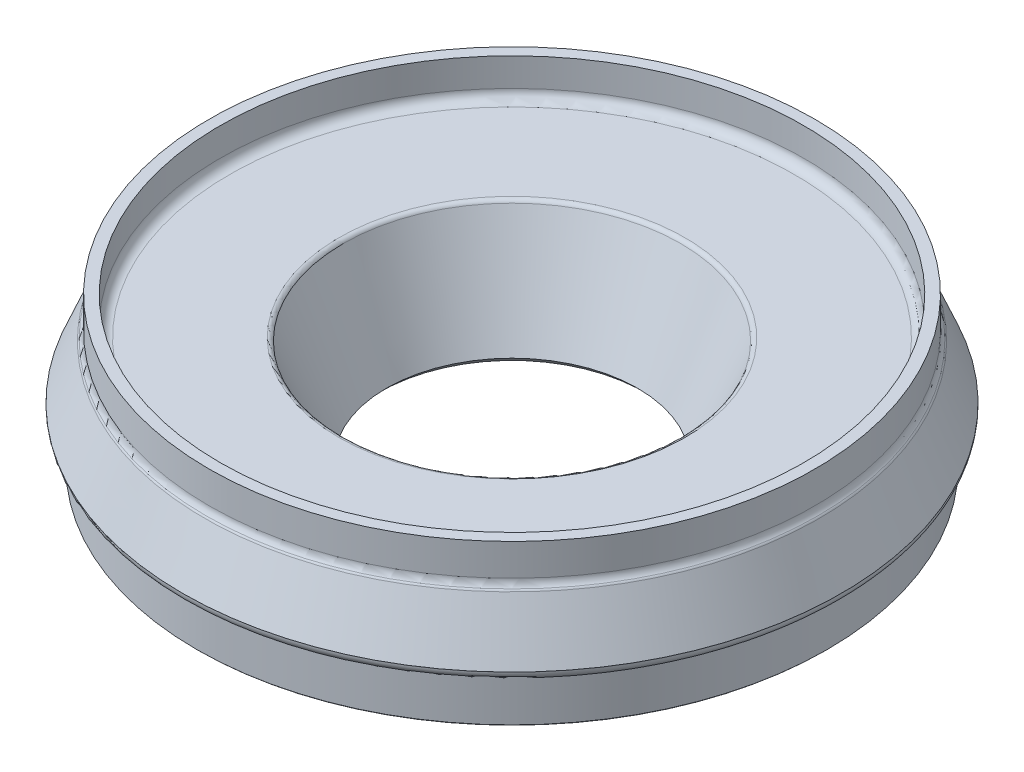
ISO-10303-21;
HEADER;
FILE_DESCRIPTION(('STEP AP214'),'2;1');
FILE_NAME('part.step','',(''),(''),'','','');
FILE_SCHEMA(('AUTOMOTIVE_DESIGN { 1 0 10303 214 1 1 1 1 }'));
ENDSEC;
DATA;
#1=APPLICATION_CONTEXT('core data for automotive mechanical design processes');
#2=APPLICATION_PROTOCOL_DEFINITION('international standard','automotive_design',2000,#1);
#3=PRODUCT_CONTEXT('',#1,'mechanical');
#4=PRODUCT('Part','Part','',(#3));
#5=PRODUCT_RELATED_PRODUCT_CATEGORY('part','',(#4));
#6=PRODUCT_DEFINITION_FORMATION('','',#4);
#7=PRODUCT_DEFINITION_CONTEXT('part definition',#1,'design');
#8=PRODUCT_DEFINITION('design','',#6,#7);
#9=PRODUCT_DEFINITION_SHAPE('','',#8);
#10=(LENGTH_UNIT() NAMED_UNIT(*) SI_UNIT(.MILLI.,.METRE.));
#11=(NAMED_UNIT(*) PLANE_ANGLE_UNIT() SI_UNIT($,.RADIAN.));
#12=(NAMED_UNIT(*) SI_UNIT($,.STERADIAN.) SOLID_ANGLE_UNIT());
#13=UNCERTAINTY_MEASURE_WITH_UNIT(LENGTH_MEASURE(1.E-05),#10,'distance_accuracy_value','');
#14=(GEOMETRIC_REPRESENTATION_CONTEXT(3) GLOBAL_UNCERTAINTY_ASSIGNED_CONTEXT((#13)) GLOBAL_UNIT_ASSIGNED_CONTEXT((#10,
#11,#12)) REPRESENTATION_CONTEXT('',''));
#15=CARTESIAN_POINT('',(0.,0.,0.));
#16=DIRECTION('',(0.,0.,1.));
#17=DIRECTION('',(1.,0.,0.));
#18=AXIS2_PLACEMENT_3D('',#15,#16,#17);
#19=CARTESIAN_POINT('',(0.,0.,0.));
#20=DIRECTION('',(0.,1.,0.));
#21=DIRECTION('',(0.,0.,1.));
#22=AXIS2_PLACEMENT_3D('',#19,#20,#21);
#23=PLANE('',#22);
#24=CARTESIAN_POINT('',(-1.805,0.,0.));
#25=DIRECTION('',(0.,1.,0.));
#26=DIRECTION('',(0.,0.,1.));
#27=AXIS2_PLACEMENT_3D('',#24,#25,#26);
#28=CIRCLE('',#27,3.34);
#29=CARTESIAN_POINT('',(-1.805,0.,3.34));
#30=VERTEX_POINT('',#29);
#31=EDGE_CURVE('E45',#30,#30,#28,.F.);
#32=ORIENTED_EDGE('',*,*,#31,.T.);
#33=EDGE_LOOP('',(#32));
#34=FACE_BOUND('',#33,.T.);
#35=CARTESIAN_POINT('',(-1.805,0.,0.));
#36=DIRECTION('',(0.,1.,0.));
#37=DIRECTION('',(0.,0.,1.));
#38=AXIS2_PLACEMENT_3D('',#35,#36,#37);
#39=CIRCLE('',#38,1.405);
#40=CARTESIAN_POINT('',(-1.805,0.,1.405));
#41=VERTEX_POINT('',#40);
#42=EDGE_CURVE('E60',#41,#41,#39,.T.);
#43=ORIENTED_EDGE('',*,*,#42,.T.);
#44=EDGE_LOOP('',(#43));
#45=FACE_BOUND('',#44,.T.);
#46=ADVANCED_FACE('F34',(#34,#45),#23,.F.);
#47=CARTESIAN_POINT('',(0.,1.20334128550827,0.));
#48=DIRECTION('',(0.,1.,0.));
#49=DIRECTION('',(0.,0.,1.));
#50=AXIS2_PLACEMENT_3D('',#47,#48,#49);
#51=PLANE('',#50);
#52=CARTESIAN_POINT('',(-1.805,1.20334128550827,0.));
#53=DIRECTION('',(0.,1.,0.));
#54=DIRECTION('',(0.,0.,1.));
#55=AXIS2_PLACEMENT_3D('',#52,#53,#54);
#56=CIRCLE('',#55,3.);
#57=CARTESIAN_POINT('',(-1.805,1.20334128550827,3.));
#58=VERTEX_POINT('',#57);
#59=EDGE_CURVE('E72',#58,#58,#56,.T.);
#60=ORIENTED_EDGE('',*,*,#59,.T.);
#61=EDGE_LOOP('',(#60));
#62=FACE_BOUND('',#61,.T.);
#63=CARTESIAN_POINT('',(-1.805,1.20334128550827,0.));
#64=DIRECTION('',(0.,1.,0.));
#65=DIRECTION('',(0.,0.,1.));
#66=AXIS2_PLACEMENT_3D('',#63,#64,#65);
#67=CIRCLE('',#66,1.8383689580383);
#68=CARTESIAN_POINT('',(-1.805,1.20334128550827,1.8383689580383));
#69=VERTEX_POINT('',#68);
#70=EDGE_CURVE('E81',#69,#69,#67,.F.);
#71=ORIENTED_EDGE('',*,*,#70,.T.);
#72=EDGE_LOOP('',(#71));
#73=FACE_BOUND('',#72,.T.);
#74=ADVANCED_FACE('F116',(#62,#73),#51,.T.);
#75=CARTESIAN_POINT('',(-1.805,1.20334128550827,0.));
#76=DIRECTION('',(0.,-1.,0.));
#77=DIRECTION('',(0.,0.,-1.));
#78=AXIS2_PLACEMENT_3D('',#75,#76,#77);
#79=CONICAL_SURFACE('',#78,3.25108159784945,0.392270948316505);
#80=CARTESIAN_POINT('',(-1.805,1.17245567819005,0.));
#81=DIRECTION('',(0.,-1.,0.));
#82=DIRECTION('',(0.,0.,-1.));
#83=AXIS2_PLACEMENT_3D('',#80,#81,#82);
#84=CIRCLE('',#83,3.26385934613364);
#85=CARTESIAN_POINT('',(-1.805,1.17245567819005,-3.26385934613364));
#86=VERTEX_POINT('',#85);
#87=EDGE_CURVE('E84',#86,#86,#84,.T.);
#88=ORIENTED_EDGE('',*,*,#87,.T.);
#89=EDGE_LOOP('',(#88));
#90=FACE_BOUND('',#89,.T.);
#91=CARTESIAN_POINT('',(-1.805,0.601670642754135,0.));
#92=DIRECTION('',(0.,-1.,0.));
#93=DIRECTION('',(0.,0.,-1.));
#94=AXIS2_PLACEMENT_3D('',#91,#92,#93);
#95=CIRCLE('',#94,3.5);
#96=CARTESIAN_POINT('',(-1.805,0.601670642754135,-3.5));
#97=VERTEX_POINT('',#96);
#98=EDGE_CURVE('E87',#97,#97,#95,.T.);
#99=ORIENTED_EDGE('',*,*,#98,.F.);
#100=EDGE_LOOP('',(#99));
#101=FACE_BOUND('',#100,.T.);
#102=ADVANCED_FACE('F122',(#90,#101),#79,.T.);
#103=CARTESIAN_POINT('',(-1.805,1.20334128550827,0.));
#104=DIRECTION('',(0.,1.,0.));
#105=DIRECTION('',(0.,0.,1.));
#106=AXIS2_PLACEMENT_3D('',#103,#104,#105);
#107=CONICAL_SURFACE('',#106,1.805,0.393804913795669);
#108=CARTESIAN_POINT('',(-1.805,0.0706459296058926,0.));
#109=DIRECTION('',(0.,1.,0.));
#110=DIRECTION('',(0.,0.,1.));
#111=AXIS2_PLACEMENT_3D('',#108,#109,#110);
#112=CIRCLE('',#111,1.33435407039411);
#113=CARTESIAN_POINT('',(-1.805,0.0706459296058926,1.33435407039411));
#114=VERTEX_POINT('',#113);
#115=EDGE_CURVE('E63',#114,#114,#112,.F.);
#116=ORIENTED_EDGE('',*,*,#115,.T.);
#117=EDGE_LOOP('',(#116));
#118=FACE_BOUND('',#117,.T.);
#119=CARTESIAN_POINT('',(-1.805,1.1725265281989,0.));
#120=DIRECTION('',(0.,-1.,0.));
#121=DIRECTION('',(0.,0.,-1.));
#122=AXIS2_PLACEMENT_3D('',#119,#120,#121);
#123=CIRCLE('',#122,1.79219616883403);
#124=CARTESIAN_POINT('',(-1.805,1.1725265281989,-1.79219616883403));
#125=VERTEX_POINT('',#124);
#126=EDGE_CURVE('E78',#125,#125,#123,.F.);
#127=ORIENTED_EDGE('',*,*,#126,.T.);
#128=EDGE_LOOP('',(#127));
#129=FACE_BOUND('',#128,.T.);
#130=ADVANCED_FACE('F129',(#118,#129),#107,.F.);
#131=CARTESIAN_POINT('',(-1.805,0.,0.));
#132=DIRECTION('',(0.,-1.,0.));
#133=DIRECTION('',(0.,0.,-1.));
#134=AXIS2_PLACEMENT_3D('',#131,#132,#133);
#135=CYLINDRICAL_SURFACE('',#134,3.5);
#136=CARTESIAN_POINT('',(-1.805,0.6,0.));
#137=DIRECTION('',(0.,1.,0.));
#138=DIRECTION('',(0.,0.,1.));
#139=AXIS2_PLACEMENT_3D('',#136,#137,#138);
#140=CIRCLE('',#139,3.5);
#141=CARTESIAN_POINT('',(-1.805,0.6,3.5));
#142=VERTEX_POINT('',#141);
#143=EDGE_CURVE('E41',#142,#142,#140,.T.);
#144=ORIENTED_EDGE('',*,*,#143,.T.);
#145=EDGE_LOOP('',(#144));
#146=FACE_BOUND('',#145,.T.);
#147=ORIENTED_EDGE('',*,*,#98,.T.);
#148=EDGE_LOOP('',(#147));
#149=FACE_BOUND('',#148,.T.);
#150=ADVANCED_FACE('F128',(#146,#149),#135,.T.);
#151=CARTESIAN_POINT('',(-1.805,1.15334128550827,0.));
#152=DIRECTION('',(0.,1.,0.));
#153=DIRECTION('',(0.,0.,1.));
#154=AXIS2_PLACEMENT_3D('',#151,#152,#153);
#155=TOROIDAL_SURFACE('',#154,3.21765718176435,0.05);
#156=CARTESIAN_POINT('',(-1.805,1.1906090851333,0.));
#157=DIRECTION('',(0.,-1.,0.));
#158=DIRECTION('',(0.,0.,-1.));
#159=AXIS2_PLACEMENT_3D('',#156,#157,#158);
#160=CIRCLE('',#159,3.25099051509771);
#161=CARTESIAN_POINT('',(-1.805,1.1906090851333,-3.25099051509771));
#162=VERTEX_POINT('',#161);
#163=EDGE_CURVE('E66',#162,#162,#160,.T.);
#164=ORIENTED_EDGE('',*,*,#163,.T.);
#165=EDGE_LOOP('',(#164));
#166=FACE_BOUND('',#165,.T.);
#167=ORIENTED_EDGE('',*,*,#87,.F.);
#168=EDGE_LOOP('',(#167));
#169=FACE_BOUND('',#168,.T.);
#170=ADVANCED_FACE('F111',(#166,#169),#155,.T.);
#171=CARTESIAN_POINT('',(-1.805,1.15334128550827,0.));
#172=DIRECTION('',(0.,1.,0.));
#173=DIRECTION('',(0.,0.,1.));
#174=AXIS2_PLACEMENT_3D('',#171,#172,#173);
#175=TOROIDAL_SURFACE('',#174,1.8383689580383,0.05);
#176=ORIENTED_EDGE('',*,*,#126,.F.);
#177=EDGE_LOOP('',(#176));
#178=FACE_BOUND('',#177,.T.);
#179=ORIENTED_EDGE('',*,*,#70,.F.);
#180=EDGE_LOOP('',(#179));
#181=FACE_BOUND('',#180,.T.);
#182=ADVANCED_FACE('F102',(#178,#181),#175,.T.);
#183=CARTESIAN_POINT('',(-1.805,1.60334128550827,0.));
#184=DIRECTION('',(0.,1.,0.));
#185=DIRECTION('',(0.,0.,1.));
#186=AXIS2_PLACEMENT_3D('',#183,#184,#185);
#187=PLANE('',#186);
#188=CARTESIAN_POINT('',(-1.805,1.60334128550827,0.));
#189=DIRECTION('',(0.,1.,0.));
#190=DIRECTION('',(0.,0.,1.));
#191=AXIS2_PLACEMENT_3D('',#188,#189,#190);
#192=CIRCLE('',#191,3.21765718176435);
#193=CARTESIAN_POINT('',(-1.805,1.60334128550827,3.21765718176435));
#194=VERTEX_POINT('',#193);
#195=EDGE_CURVE('E90',#194,#194,#192,.T.);
#196=ORIENTED_EDGE('',*,*,#195,.T.);
#197=EDGE_LOOP('',(#196));
#198=FACE_BOUND('',#197,.T.);
#199=CARTESIAN_POINT('',(-1.805,1.60334128550827,0.));
#200=DIRECTION('',(0.,1.,0.));
#201=DIRECTION('',(0.,0.,1.));
#202=AXIS2_PLACEMENT_3D('',#199,#200,#201);
#203=CIRCLE('',#202,3.1);
#204=CARTESIAN_POINT('',(-1.805,1.60334128550827,3.1));
#205=VERTEX_POINT('',#204);
#206=EDGE_CURVE('E93',#205,#205,#203,.T.);
#207=ORIENTED_EDGE('',*,*,#206,.F.);
#208=EDGE_LOOP('',(#207));
#209=FACE_BOUND('',#208,.T.);
#210=ADVANCED_FACE('F99',(#198,#209),#187,.T.);
#211=CARTESIAN_POINT('',(-1.805,1.60334128550827,0.));
#212=DIRECTION('',(0.,-1.,0.));
#213=DIRECTION('',(0.,0.,-1.));
#214=AXIS2_PLACEMENT_3D('',#211,#212,#213);
#215=CYLINDRICAL_SURFACE('',#214,3.21765718176435);
#216=CARTESIAN_POINT('',(-1.805,1.26514468438326,0.));
#217=DIRECTION('',(0.,1.,0.));
#218=DIRECTION('',(0.,0.,1.));
#219=AXIS2_PLACEMENT_3D('',#216,#217,#218);
#220=CIRCLE('',#219,3.21765718176435);
#221=CARTESIAN_POINT('',(-1.805,1.26514468438326,3.21765718176435));
#222=VERTEX_POINT('',#221);
#223=EDGE_CURVE('E69',#222,#222,#220,.T.);
#224=ORIENTED_EDGE('',*,*,#223,.T.);
#225=EDGE_LOOP('',(#224));
#226=FACE_BOUND('',#225,.T.);
#227=ORIENTED_EDGE('',*,*,#195,.F.);
#228=EDGE_LOOP('',(#227));
#229=FACE_BOUND('',#228,.T.);
#230=ADVANCED_FACE('F101',(#226,#229),#215,.T.);
#231=CARTESIAN_POINT('',(-1.805,1.60334128550827,0.));
#232=DIRECTION('',(0.,-1.,0.));
#233=DIRECTION('',(0.,0.,-1.));
#234=AXIS2_PLACEMENT_3D('',#231,#232,#233);
#235=CYLINDRICAL_SURFACE('',#234,3.1);
#236=CARTESIAN_POINT('',(-1.805,1.30334128550827,0.));
#237=DIRECTION('',(0.,1.,0.));
#238=DIRECTION('',(0.,0.,1.));
#239=AXIS2_PLACEMENT_3D('',#236,#237,#238);
#240=CIRCLE('',#239,3.1);
#241=CARTESIAN_POINT('',(-1.805,1.30334128550827,3.1));
#242=VERTEX_POINT('',#241);
#243=EDGE_CURVE('E75',#242,#242,#240,.F.);
#244=ORIENTED_EDGE('',*,*,#243,.T.);
#245=EDGE_LOOP('',(#244));
#246=FACE_BOUND('',#245,.T.);
#247=ORIENTED_EDGE('',*,*,#206,.T.);
#248=EDGE_LOOP('',(#247));
#249=FACE_BOUND('',#248,.T.);
#250=ADVANCED_FACE('F97',(#246,#249),#235,.F.);
#251=CARTESIAN_POINT('',(-1.805,1.30334128550827,0.));
#252=DIRECTION('',(0.,1.,0.));
#253=DIRECTION('',(0.,0.,1.));
#254=AXIS2_PLACEMENT_3D('',#251,#252,#253);
#255=TOROIDAL_SURFACE('',#254,3.,0.1);
#256=ORIENTED_EDGE('',*,*,#59,.F.);
#257=EDGE_LOOP('',(#256));
#258=FACE_BOUND('',#257,.T.);
#259=ORIENTED_EDGE('',*,*,#243,.F.);
#260=EDGE_LOOP('',(#259));
#261=FACE_BOUND('',#260,.T.);
#262=ADVANCED_FACE('F139',(#258,#261),#255,.F.);
#263=CARTESIAN_POINT('',(-1.805,1.26514468438326,0.));
#264=DIRECTION('',(0.,1.,0.));
#265=DIRECTION('',(0.,0.,1.));
#266=AXIS2_PLACEMENT_3D('',#263,#264,#265);
#267=TOROIDAL_SURFACE('',#266,3.31765718176435,0.1);
#268=ORIENTED_EDGE('',*,*,#163,.F.);
#269=EDGE_LOOP('',(#268));
#270=FACE_BOUND('',#269,.T.);
#271=ORIENTED_EDGE('',*,*,#223,.F.);
#272=EDGE_LOOP('',(#271));
#273=FACE_BOUND('',#272,.T.);
#274=ADVANCED_FACE('F142',(#270,#273),#267,.F.);
#275=CARTESIAN_POINT('',(-1.805,0.0706459296058927,0.));
#276=DIRECTION('',(0.,-1.,0.));
#277=DIRECTION('',(0.,0.,-1.));
#278=AXIS2_PLACEMENT_3D('',#275,#276,#277);
#279=CONICAL_SURFACE('',#278,1.33435407039411,0.785398163397442);
#280=ORIENTED_EDGE('',*,*,#42,.F.);
#281=EDGE_LOOP('',(#280));
#282=FACE_BOUND('',#281,.T.);
#283=ORIENTED_EDGE('',*,*,#115,.F.);
#284=EDGE_LOOP('',(#283));
#285=FACE_BOUND('',#284,.T.);
#286=ADVANCED_FACE('F146',(#282,#285),#279,.F.);
#287=CARTESIAN_POINT('',(-1.805,0.5,0.));
#288=DIRECTION('',(0.,1.,0.));
#289=DIRECTION('',(0.,0.,1.));
#290=AXIS2_PLACEMENT_3D('',#287,#288,#289);
#291=PLANE('',#290);
#292=CARTESIAN_POINT('',(-1.805,0.5,0.));
#293=DIRECTION('',(0.,1.,0.));
#294=DIRECTION('',(0.,0.,1.));
#295=AXIS2_PLACEMENT_3D('',#292,#293,#294);
#296=CIRCLE('',#295,3.4);
#297=CARTESIAN_POINT('',(-1.805,0.5,3.4));
#298=VERTEX_POINT('',#297);
#299=EDGE_CURVE('E10',#298,#298,#296,.F.);
#300=ORIENTED_EDGE('',*,*,#299,.T.);
#301=EDGE_LOOP('',(#300));
#302=FACE_BOUND('',#301,.T.);
#303=CARTESIAN_POINT('',(-1.805,0.5,0.));
#304=DIRECTION('',(0.,1.,0.));
#305=DIRECTION('',(0.,0.,1.));
#306=AXIS2_PLACEMENT_3D('',#303,#304,#305);
#307=CIRCLE('',#306,3.36);
#308=CARTESIAN_POINT('',(-1.805,0.5,3.36));
#309=VERTEX_POINT('',#308);
#310=EDGE_CURVE('E57',#309,#309,#307,.T.);
#311=ORIENTED_EDGE('',*,*,#310,.T.);
#312=EDGE_LOOP('',(#311));
#313=FACE_BOUND('',#312,.T.);
#314=ADVANCED_FACE('F150',(#302,#313),#291,.F.);
#315=CARTESIAN_POINT('',(-1.805,0.,0.));
#316=DIRECTION('',(0.,1.,0.));
#317=DIRECTION('',(0.,0.,1.));
#318=AXIS2_PLACEMENT_3D('',#315,#316,#317);
#319=CYLINDRICAL_SURFACE('',#318,3.35);
#320=CARTESIAN_POINT('',(-1.805,0.489999999999999,0.));
#321=DIRECTION('',(0.,1.,0.));
#322=DIRECTION('',(0.,0.,1.));
#323=AXIS2_PLACEMENT_3D('',#320,#321,#322);
#324=CIRCLE('',#323,3.35);
#325=CARTESIAN_POINT('',(-1.805,0.489999999999999,3.35));
#326=VERTEX_POINT('',#325);
#327=EDGE_CURVE('E49',#326,#326,#324,.F.);
#328=ORIENTED_EDGE('',*,*,#327,.T.);
#329=EDGE_LOOP('',(#328));
#330=FACE_BOUND('',#329,.T.);
#331=CARTESIAN_POINT('',(-1.805,0.00999999999999916,0.));
#332=DIRECTION('',(0.,1.,0.));
#333=DIRECTION('',(0.,0.,1.));
#334=AXIS2_PLACEMENT_3D('',#331,#332,#333);
#335=CIRCLE('',#334,3.35);
#336=CARTESIAN_POINT('',(-1.805,0.00999999999999916,3.35));
#337=VERTEX_POINT('',#336);
#338=EDGE_CURVE('E54',#337,#337,#335,.T.);
#339=ORIENTED_EDGE('',*,*,#338,.T.);
#340=EDGE_LOOP('',(#339));
#341=FACE_BOUND('',#340,.T.);
#342=ADVANCED_FACE('F155',(#330,#341),#319,.T.);
#343=CARTESIAN_POINT('',(-1.805,0.5,0.));
#344=DIRECTION('',(0.,1.,0.));
#345=DIRECTION('',(0.,0.,1.));
#346=AXIS2_PLACEMENT_3D('',#343,#344,#345);
#347=CONICAL_SURFACE('',#346,3.36,0.785398163397427);
#348=ORIENTED_EDGE('',*,*,#327,.F.);
#349=EDGE_LOOP('',(#348));
#350=FACE_BOUND('',#349,.T.);
#351=ORIENTED_EDGE('',*,*,#310,.F.);
#352=EDGE_LOOP('',(#351));
#353=FACE_BOUND('',#352,.T.);
#354=ADVANCED_FACE('F152',(#350,#353),#347,.T.);
#355=CARTESIAN_POINT('',(-1.805,0.00999999999999916,0.));
#356=DIRECTION('',(0.,1.,0.));
#357=DIRECTION('',(0.,0.,1.));
#358=AXIS2_PLACEMENT_3D('',#355,#356,#357);
#359=CONICAL_SURFACE('',#358,3.35,0.78539816339747);
#360=ORIENTED_EDGE('',*,*,#31,.F.);
#361=EDGE_LOOP('',(#360));
#362=FACE_BOUND('',#361,.T.);
#363=ORIENTED_EDGE('',*,*,#338,.F.);
#364=EDGE_LOOP('',(#363));
#365=FACE_BOUND('',#364,.T.);
#366=ADVANCED_FACE('F154',(#362,#365),#359,.T.);
#367=CARTESIAN_POINT('',(-1.805,0.6,0.));
#368=DIRECTION('',(0.,1.,0.));
#369=DIRECTION('',(0.,0.,1.));
#370=AXIS2_PLACEMENT_3D('',#367,#368,#369);
#371=TOROIDAL_SURFACE('',#370,3.4,0.1);
#372=ORIENTED_EDGE('',*,*,#299,.F.);
#373=EDGE_LOOP('',(#372));
#374=FACE_BOUND('',#373,.T.);
#375=ORIENTED_EDGE('',*,*,#143,.F.);
#376=EDGE_LOOP('',(#375));
#377=FACE_BOUND('',#376,.T.);
#378=ADVANCED_FACE('F36',(#374,#377),#371,.T.);
#379=CLOSED_SHELL('',(#46,#74,#102,#130,#150,#170,#182,#210,#230,#250,#262,#274,#286,#314,#342,
#354,#366,#378));
#380=MANIFOLD_SOLID_BREP('B2',#379);
#381=ADVANCED_BREP_SHAPE_REPRESENTATION('',(#18,#380),#14);
#382=SHAPE_DEFINITION_REPRESENTATION(#9,#381);
ENDSEC;
END-ISO-10303-21;
